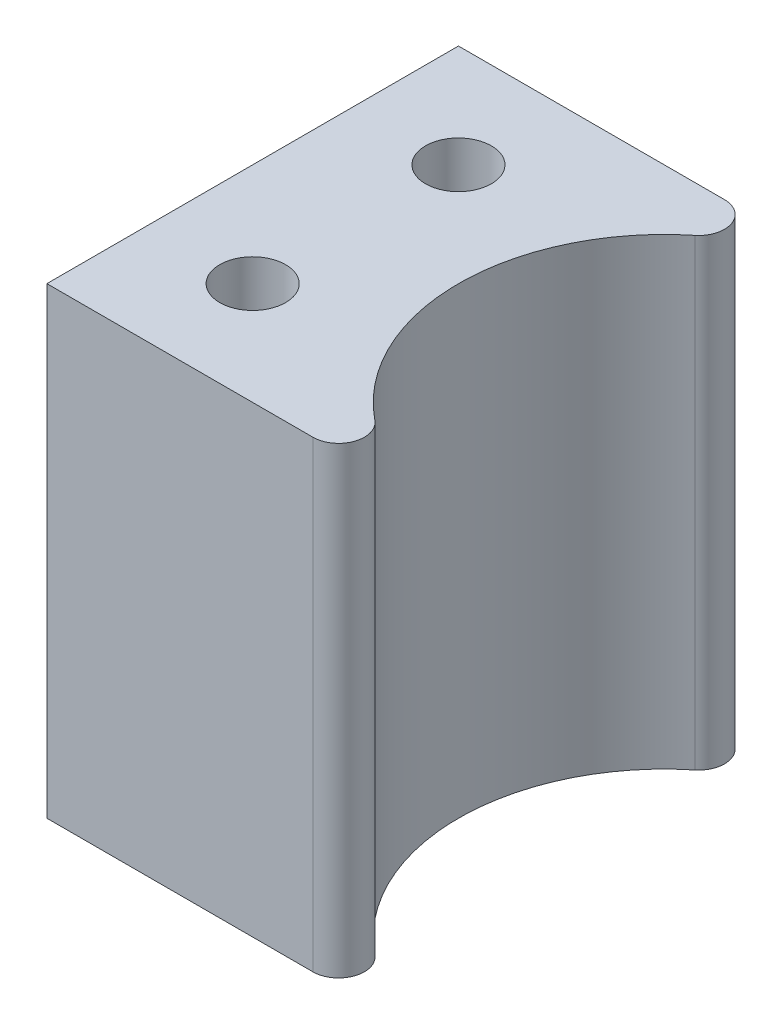
ISO-10303-21;
HEADER;
FILE_DESCRIPTION(('STEP AP214'),'2;1');
FILE_NAME('part.step','',(''),(''),'','','');
FILE_SCHEMA(('AUTOMOTIVE_DESIGN { 1 0 10303 214 1 1 1 1 }'));
ENDSEC;
DATA;
#1=APPLICATION_CONTEXT('core data for automotive mechanical design processes');
#2=APPLICATION_PROTOCOL_DEFINITION('international standard','automotive_design',2000,#1);
#3=PRODUCT_CONTEXT('',#1,'mechanical');
#4=PRODUCT('Part','Part','',(#3));
#5=PRODUCT_RELATED_PRODUCT_CATEGORY('part','',(#4));
#6=PRODUCT_DEFINITION_FORMATION('','',#4);
#7=PRODUCT_DEFINITION_CONTEXT('part definition',#1,'design');
#8=PRODUCT_DEFINITION('design','',#6,#7);
#9=PRODUCT_DEFINITION_SHAPE('','',#8);
#10=(LENGTH_UNIT() NAMED_UNIT(*) SI_UNIT(.MILLI.,.METRE.));
#11=(NAMED_UNIT(*) PLANE_ANGLE_UNIT() SI_UNIT($,.RADIAN.));
#12=(NAMED_UNIT(*) SI_UNIT($,.STERADIAN.) SOLID_ANGLE_UNIT());
#13=UNCERTAINTY_MEASURE_WITH_UNIT(LENGTH_MEASURE(1.E-05),#10,'distance_accuracy_value','');
#14=(GEOMETRIC_REPRESENTATION_CONTEXT(3) GLOBAL_UNCERTAINTY_ASSIGNED_CONTEXT((#13)) GLOBAL_UNIT_ASSIGNED_CONTEXT((#10,
#11,#12)) REPRESENTATION_CONTEXT('',''));
#15=CARTESIAN_POINT('',(0.,0.,0.));
#16=DIRECTION('',(0.,0.,1.));
#17=DIRECTION('',(1.,0.,0.));
#18=AXIS2_PLACEMENT_3D('',#15,#16,#17);
#19=CARTESIAN_POINT('',(-2.38125,28.575,-12.7));
#20=DIRECTION('',(0.,-1.,0.));
#21=DIRECTION('',(0.,0.,-1.));
#22=AXIS2_PLACEMENT_3D('',#19,#20,#21);
#23=CYLINDRICAL_SURFACE('',#22,12.7);
#24=CARTESIAN_POINT('',(-2.38125,0.,-12.7));
#25=DIRECTION('',(0.,1.,0.));
#26=DIRECTION('',(0.,0.,1.));
#27=AXIS2_PLACEMENT_3D('',#24,#25,#26);
#28=CIRCLE('',#27,12.7);
#29=CARTESIAN_POINT('',(-10.3636998853948,0.,-22.5777777777778));
#30=VERTEX_POINT('',#29);
#31=CARTESIAN_POINT('',(-10.3636998853948,0.,-2.82222222222222));
#32=VERTEX_POINT('',#31);
#33=EDGE_CURVE('E124',#30,#32,#28,.T.);
#34=ORIENTED_EDGE('',*,*,#33,.F.);
#35=DIRECTION('',(0.,-1.,0.));
#36=VECTOR('',#35,1.);
#37=CARTESIAN_POINT('',(-10.3636998853948,28.575,-22.5777777777778));
#38=LINE('',#37,#36);
#39=CARTESIAN_POINT('',(-10.3636998853948,28.575,-22.5777777777778));
#40=VERTEX_POINT('',#39);
#41=EDGE_CURVE('E11',#40,#30,#38,.T.);
#42=ORIENTED_EDGE('',*,*,#41,.F.);
#43=CARTESIAN_POINT('',(-2.38125,28.575,-12.7));
#44=DIRECTION('',(0.,1.,0.));
#45=DIRECTION('',(0.,0.,1.));
#46=AXIS2_PLACEMENT_3D('',#43,#44,#45);
#47=CIRCLE('',#46,12.7);
#48=CARTESIAN_POINT('',(-10.3636998853948,28.575,-2.82222222222222));
#49=VERTEX_POINT('',#48);
#50=EDGE_CURVE('E143',#40,#49,#47,.T.);
#51=ORIENTED_EDGE('',*,*,#50,.T.);
#52=DIRECTION('',(0.,-1.,0.));
#53=VECTOR('',#52,1.);
#54=CARTESIAN_POINT('',(-10.3636998853948,28.575,-2.82222222222222));
#55=LINE('',#54,#53);
#56=EDGE_CURVE('E79',#49,#32,#55,.T.);
#57=ORIENTED_EDGE('',*,*,#56,.T.);
#58=EDGE_LOOP('',(#34,#42,#51,#57));
#59=FACE_BOUND('',#58,.T.);
#60=ADVANCED_FACE('F35',(#59),#23,.F.);
#61=CARTESIAN_POINT('',(-11.3615061210692,28.575,-23.8125));
#62=DIRECTION('',(0.,-1.,0.));
#63=DIRECTION('',(0.,0.,-1.));
#64=AXIS2_PLACEMENT_3D('',#61,#62,#63);
#65=CYLINDRICAL_SURFACE('',#64,1.5875);
#66=CARTESIAN_POINT('',(-11.3615061210692,0.,-23.8125));
#67=DIRECTION('',(0.,1.,0.));
#68=DIRECTION('',(0.,0.,1.));
#69=AXIS2_PLACEMENT_3D('',#66,#67,#68);
#70=CIRCLE('',#69,1.5875);
#71=CARTESIAN_POINT('',(-11.3615061210692,0.,-25.4));
#72=VERTEX_POINT('',#71);
#73=EDGE_CURVE('E127',#72,#30,#70,.F.);
#74=ORIENTED_EDGE('',*,*,#73,.F.);
#75=DIRECTION('',(0.,-1.,0.));
#76=VECTOR('',#75,1.);
#77=CARTESIAN_POINT('',(-11.3615061210692,28.575,-25.4));
#78=LINE('',#77,#76);
#79=CARTESIAN_POINT('',(-11.3615061210692,28.575,-25.4));
#80=VERTEX_POINT('',#79);
#81=EDGE_CURVE('E43',#80,#72,#78,.T.);
#82=ORIENTED_EDGE('',*,*,#81,.F.);
#83=CARTESIAN_POINT('',(-11.3615061210692,28.575,-23.8125));
#84=DIRECTION('',(0.,1.,0.));
#85=DIRECTION('',(0.,0.,1.));
#86=AXIS2_PLACEMENT_3D('',#83,#84,#85);
#87=CIRCLE('',#86,1.5875);
#88=EDGE_CURVE('E113',#80,#40,#87,.F.);
#89=ORIENTED_EDGE('',*,*,#88,.T.);
#90=ORIENTED_EDGE('',*,*,#41,.T.);
#91=EDGE_LOOP('',(#74,#82,#89,#90));
#92=FACE_BOUND('',#91,.T.);
#93=ADVANCED_FACE('F152',(#92),#65,.T.);
#94=CARTESIAN_POINT('',(0.,28.575,-25.4));
#95=DIRECTION('',(0.,0.,-1.));
#96=DIRECTION('',(-1.,0.,0.));
#97=AXIS2_PLACEMENT_3D('',#94,#95,#96);
#98=PLANE('',#97);
#99=DIRECTION('',(1.,0.,0.));
#100=VECTOR('',#99,1.);
#101=CARTESIAN_POINT('',(0.,0.,-25.4));
#102=LINE('',#101,#100);
#103=CARTESIAN_POINT('',(-27.78125,0.,-25.4));
#104=VERTEX_POINT('',#103);
#105=EDGE_CURVE('E130',#104,#72,#102,.T.);
#106=ORIENTED_EDGE('',*,*,#105,.F.);
#107=DIRECTION('',(0.,-1.,0.));
#108=VECTOR('',#107,1.);
#109=CARTESIAN_POINT('',(-27.78125,28.575,-25.4));
#110=LINE('',#109,#108);
#111=CARTESIAN_POINT('',(-27.78125,28.575,-25.4));
#112=VERTEX_POINT('',#111);
#113=EDGE_CURVE('E100',#112,#104,#110,.T.);
#114=ORIENTED_EDGE('',*,*,#113,.F.);
#115=DIRECTION('',(1.,0.,0.));
#116=VECTOR('',#115,1.);
#117=CARTESIAN_POINT('',(0.,28.575,-25.4));
#118=LINE('',#117,#116);
#119=EDGE_CURVE('E111',#112,#80,#118,.T.);
#120=ORIENTED_EDGE('',*,*,#119,.T.);
#121=ORIENTED_EDGE('',*,*,#81,.T.);
#122=EDGE_LOOP('',(#106,#114,#120,#121));
#123=FACE_BOUND('',#122,.T.);
#124=ADVANCED_FACE('F149',(#123),#98,.T.);
#125=CARTESIAN_POINT('',(-27.78125,28.575,0.));
#126=DIRECTION('',(-1.,0.,0.));
#127=DIRECTION('',(0.,0.,1.));
#128=AXIS2_PLACEMENT_3D('',#125,#126,#127);
#129=PLANE('',#128);
#130=DIRECTION('',(0.,0.,-1.));
#131=VECTOR('',#130,1.);
#132=CARTESIAN_POINT('',(-27.78125,0.,0.));
#133=LINE('',#132,#131);
#134=CARTESIAN_POINT('',(-27.78125,0.,0.));
#135=VERTEX_POINT('',#134);
#136=EDGE_CURVE('E99',#135,#104,#133,.T.);
#137=ORIENTED_EDGE('',*,*,#136,.F.);
#138=DIRECTION('',(0.,-1.,0.));
#139=VECTOR('',#138,1.);
#140=CARTESIAN_POINT('',(-27.78125,28.575,0.));
#141=LINE('',#140,#139);
#142=CARTESIAN_POINT('',(-27.78125,28.575,0.));
#143=VERTEX_POINT('',#142);
#144=EDGE_CURVE('E93',#143,#135,#141,.T.);
#145=ORIENTED_EDGE('',*,*,#144,.F.);
#146=DIRECTION('',(0.,0.,-1.));
#147=VECTOR('',#146,1.);
#148=CARTESIAN_POINT('',(-27.78125,28.575,0.));
#149=LINE('',#148,#147);
#150=EDGE_CURVE('E97',#143,#112,#149,.T.);
#151=ORIENTED_EDGE('',*,*,#150,.T.);
#152=ORIENTED_EDGE('',*,*,#113,.T.);
#153=EDGE_LOOP('',(#137,#145,#151,#152));
#154=FACE_BOUND('',#153,.T.);
#155=ADVANCED_FACE('F95',(#154),#129,.T.);
#156=CARTESIAN_POINT('',(0.,28.575,0.));
#157=DIRECTION('',(0.,0.,-1.));
#158=DIRECTION('',(-1.,0.,0.));
#159=AXIS2_PLACEMENT_3D('',#156,#157,#158);
#160=PLANE('',#159);
#161=DIRECTION('',(1.,0.,0.));
#162=VECTOR('',#161,1.);
#163=CARTESIAN_POINT('',(0.,0.,0.));
#164=LINE('',#163,#162);
#165=CARTESIAN_POINT('',(-11.3615061210692,0.,0.));
#166=VERTEX_POINT('',#165);
#167=EDGE_CURVE('E72',#135,#166,#164,.T.);
#168=ORIENTED_EDGE('',*,*,#167,.T.);
#169=DIRECTION('',(0.,-1.,0.));
#170=VECTOR('',#169,1.);
#171=CARTESIAN_POINT('',(-11.3615061210692,28.575,0.));
#172=LINE('',#171,#170);
#173=CARTESIAN_POINT('',(-11.3615061210692,28.575,0.));
#174=VERTEX_POINT('',#173);
#175=EDGE_CURVE('E101',#174,#166,#172,.T.);
#176=ORIENTED_EDGE('',*,*,#175,.F.);
#177=DIRECTION('',(1.,0.,0.));
#178=VECTOR('',#177,1.);
#179=CARTESIAN_POINT('',(0.,28.575,0.));
#180=LINE('',#179,#178);
#181=EDGE_CURVE('E103',#143,#174,#180,.T.);
#182=ORIENTED_EDGE('',*,*,#181,.F.);
#183=ORIENTED_EDGE('',*,*,#144,.T.);
#184=EDGE_LOOP('',(#168,#176,#182,#183));
#185=FACE_BOUND('',#184,.T.);
#186=ADVANCED_FACE('F104',(#185),#160,.F.);
#187=CARTESIAN_POINT('',(-21.43125,28.575,-6.35));
#188=DIRECTION('',(0.,-1.,0.));
#189=DIRECTION('',(0.,0.,-1.));
#190=AXIS2_PLACEMENT_3D('',#187,#188,#189);
#191=CYLINDRICAL_SURFACE('',#190,2.032);
#192=CARTESIAN_POINT('',(-21.43125,28.575,-6.35));
#193=DIRECTION('',(0.,1.,0.));
#194=DIRECTION('',(0.,0.,1.));
#195=AXIS2_PLACEMENT_3D('',#192,#193,#194);
#196=CIRCLE('',#195,2.032);
#197=CARTESIAN_POINT('',(-21.43125,28.575,-4.318));
#198=VERTEX_POINT('',#197);
#199=EDGE_CURVE('E118',#198,#198,#196,.T.);
#200=ORIENTED_EDGE('',*,*,#199,.T.);
#201=EDGE_LOOP('',(#200));
#202=FACE_BOUND('',#201,.T.);
#203=CARTESIAN_POINT('',(-21.43125,0.,-6.35));
#204=DIRECTION('',(0.,1.,0.));
#205=DIRECTION('',(0.,0.,1.));
#206=AXIS2_PLACEMENT_3D('',#203,#204,#205);
#207=CIRCLE('',#206,2.032);
#208=CARTESIAN_POINT('',(-21.43125,0.,-4.318));
#209=VERTEX_POINT('',#208);
#210=EDGE_CURVE('E137',#209,#209,#207,.T.);
#211=ORIENTED_EDGE('',*,*,#210,.F.);
#212=EDGE_LOOP('',(#211));
#213=FACE_BOUND('',#212,.T.);
#214=ADVANCED_FACE('F173',(#202,#213),#191,.F.);
#215=CARTESIAN_POINT('',(-11.3615061210692,28.575,-1.5875));
#216=DIRECTION('',(0.,-1.,0.));
#217=DIRECTION('',(0.,0.,-1.));
#218=AXIS2_PLACEMENT_3D('',#215,#216,#217);
#219=CYLINDRICAL_SURFACE('',#218,1.5875);
#220=CARTESIAN_POINT('',(-11.3615061210692,0.,-1.5875));
#221=DIRECTION('',(0.,1.,0.));
#222=DIRECTION('',(0.,0.,1.));
#223=AXIS2_PLACEMENT_3D('',#220,#221,#222);
#224=CIRCLE('',#223,1.5875);
#225=EDGE_CURVE('E135',#166,#32,#224,.T.);
#226=ORIENTED_EDGE('',*,*,#225,.T.);
#227=ORIENTED_EDGE('',*,*,#56,.F.);
#228=CARTESIAN_POINT('',(-11.3615061210692,28.575,-1.5875));
#229=DIRECTION('',(0.,1.,0.));
#230=DIRECTION('',(0.,0.,1.));
#231=AXIS2_PLACEMENT_3D('',#228,#229,#230);
#232=CIRCLE('',#231,1.5875);
#233=EDGE_CURVE('E51',#174,#49,#232,.T.);
#234=ORIENTED_EDGE('',*,*,#233,.F.);
#235=ORIENTED_EDGE('',*,*,#175,.T.);
#236=EDGE_LOOP('',(#226,#227,#234,#235));
#237=FACE_BOUND('',#236,.T.);
#238=ADVANCED_FACE('F158',(#237),#219,.T.);
#239=CARTESIAN_POINT('',(-21.43125,28.575,-19.05));
#240=DIRECTION('',(0.,-1.,0.));
#241=DIRECTION('',(0.,0.,-1.));
#242=AXIS2_PLACEMENT_3D('',#239,#240,#241);
#243=CYLINDRICAL_SURFACE('',#242,2.032);
#244=CARTESIAN_POINT('',(-21.43125,28.575,-19.05));
#245=DIRECTION('',(0.,1.,0.));
#246=DIRECTION('',(0.,0.,1.));
#247=AXIS2_PLACEMENT_3D('',#244,#245,#246);
#248=CIRCLE('',#247,2.032);
#249=CARTESIAN_POINT('',(-21.43125,28.575,-17.018));
#250=VERTEX_POINT('',#249);
#251=EDGE_CURVE('E121',#250,#250,#248,.F.);
#252=ORIENTED_EDGE('',*,*,#251,.F.);
#253=EDGE_LOOP('',(#252));
#254=FACE_BOUND('',#253,.T.);
#255=CARTESIAN_POINT('',(-21.43125,0.,-19.05));
#256=DIRECTION('',(0.,1.,0.));
#257=DIRECTION('',(0.,0.,1.));
#258=AXIS2_PLACEMENT_3D('',#255,#256,#257);
#259=CIRCLE('',#258,2.032);
#260=CARTESIAN_POINT('',(-21.43125,0.,-17.018));
#261=VERTEX_POINT('',#260);
#262=EDGE_CURVE('E140',#261,#261,#259,.F.);
#263=ORIENTED_EDGE('',*,*,#262,.T.);
#264=EDGE_LOOP('',(#263));
#265=FACE_BOUND('',#264,.T.);
#266=ADVANCED_FACE('F176',(#254,#265),#243,.F.);
#267=CARTESIAN_POINT('',(0.,28.575,0.));
#268=DIRECTION('',(0.,1.,0.));
#269=DIRECTION('',(0.,0.,1.));
#270=AXIS2_PLACEMENT_3D('',#267,#268,#269);
#271=PLANE('',#270);
#272=ORIENTED_EDGE('',*,*,#50,.F.);
#273=ORIENTED_EDGE('',*,*,#88,.F.);
#274=ORIENTED_EDGE('',*,*,#119,.F.);
#275=ORIENTED_EDGE('',*,*,#150,.F.);
#276=ORIENTED_EDGE('',*,*,#181,.T.);
#277=ORIENTED_EDGE('',*,*,#233,.T.);
#278=EDGE_LOOP('',(#272,#273,#274,#275,#276,#277));
#279=FACE_BOUND('',#278,.T.);
#280=ORIENTED_EDGE('',*,*,#199,.F.);
#281=EDGE_LOOP('',(#280));
#282=FACE_BOUND('',#281,.T.);
#283=ORIENTED_EDGE('',*,*,#251,.T.);
#284=EDGE_LOOP('',(#283));
#285=FACE_BOUND('',#284,.T.);
#286=ADVANCED_FACE('F107',(#279,#282,#285),#271,.T.);
#287=CARTESIAN_POINT('',(0.,0.,0.));
#288=DIRECTION('',(0.,1.,0.));
#289=DIRECTION('',(0.,0.,1.));
#290=AXIS2_PLACEMENT_3D('',#287,#288,#289);
#291=PLANE('',#290);
#292=ORIENTED_EDGE('',*,*,#33,.T.);
#293=ORIENTED_EDGE('',*,*,#225,.F.);
#294=ORIENTED_EDGE('',*,*,#167,.F.);
#295=ORIENTED_EDGE('',*,*,#136,.T.);
#296=ORIENTED_EDGE('',*,*,#105,.T.);
#297=ORIENTED_EDGE('',*,*,#73,.T.);
#298=EDGE_LOOP('',(#292,#293,#294,#295,#296,#297));
#299=FACE_BOUND('',#298,.T.);
#300=ORIENTED_EDGE('',*,*,#210,.T.);
#301=EDGE_LOOP('',(#300));
#302=FACE_BOUND('',#301,.T.);
#303=ORIENTED_EDGE('',*,*,#262,.F.);
#304=EDGE_LOOP('',(#303));
#305=FACE_BOUND('',#304,.T.);
#306=ADVANCED_FACE('F154',(#299,#302,#305),#291,.F.);
#307=CLOSED_SHELL('',(#60,#93,#124,#155,#186,#214,#238,#266,#286,#306));
#308=MANIFOLD_SOLID_BREP('B2',#307);
#309=ADVANCED_BREP_SHAPE_REPRESENTATION('',(#18,#308),#14);
#310=SHAPE_DEFINITION_REPRESENTATION(#9,#309);
ENDSEC;
END-ISO-10303-21;
